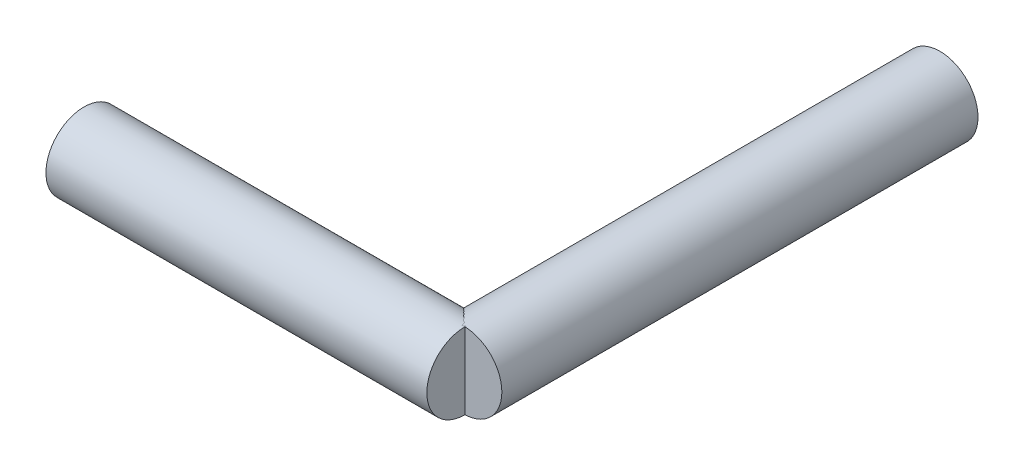
ISO-10303-21;
HEADER;
FILE_DESCRIPTION(('STEP AP214'),'2;1');
FILE_NAME('part.step','',(''),(''),'','','');
FILE_SCHEMA(('AUTOMOTIVE_DESIGN { 1 0 10303 214 1 1 1 1 }'));
ENDSEC;
DATA;
#1=APPLICATION_CONTEXT('core data for automotive mechanical design processes');
#2=APPLICATION_PROTOCOL_DEFINITION('international standard','automotive_design',2000,#1);
#3=PRODUCT_CONTEXT('',#1,'mechanical');
#4=PRODUCT('Part','Part','',(#3));
#5=PRODUCT_RELATED_PRODUCT_CATEGORY('part','',(#4));
#6=PRODUCT_DEFINITION_FORMATION('','',#4);
#7=PRODUCT_DEFINITION_CONTEXT('part definition',#1,'design');
#8=PRODUCT_DEFINITION('design','',#6,#7);
#9=PRODUCT_DEFINITION_SHAPE('','',#8);
#10=(LENGTH_UNIT() NAMED_UNIT(*) SI_UNIT(.MILLI.,.METRE.));
#11=(NAMED_UNIT(*) PLANE_ANGLE_UNIT() SI_UNIT($,.RADIAN.));
#12=(NAMED_UNIT(*) SI_UNIT($,.STERADIAN.) SOLID_ANGLE_UNIT());
#13=UNCERTAINTY_MEASURE_WITH_UNIT(LENGTH_MEASURE(1.E-05),#10,'distance_accuracy_value','');
#14=(GEOMETRIC_REPRESENTATION_CONTEXT(3) GLOBAL_UNCERTAINTY_ASSIGNED_CONTEXT((#13)) GLOBAL_UNIT_ASSIGNED_CONTEXT((#10,
#11,#12)) REPRESENTATION_CONTEXT('',''));
#15=CARTESIAN_POINT('',(0.,0.,0.));
#16=DIRECTION('',(0.,0.,1.));
#17=DIRECTION('',(1.,0.,0.));
#18=AXIS2_PLACEMENT_3D('',#15,#16,#17);
#19=CARTESIAN_POINT('',(79.7569128165846,0.,-100.));
#20=DIRECTION('',(0.,0.,1.));
#21=DIRECTION('',(1.,0.,0.));
#22=AXIS2_PLACEMENT_3D('',#19,#20,#21);
#23=CYLINDRICAL_SURFACE('',#22,8.);
#24=CARTESIAN_POINT('',(79.7569128165846,0.,-100.));
#25=DIRECTION('',(0.,0.,1.));
#26=DIRECTION('',(1.,0.,0.));
#27=AXIS2_PLACEMENT_3D('',#24,#25,#26);
#28=CIRCLE('',#27,8.);
#29=CARTESIAN_POINT('',(87.7569128165846,0.,-100.));
#30=VERTEX_POINT('',#29);
#31=EDGE_CURVE('E11',#30,#30,#28,.T.);
#32=ORIENTED_EDGE('',*,*,#31,.T.);
#33=EDGE_LOOP('',(#32));
#34=FACE_BOUND('',#33,.T.);
#35=CARTESIAN_POINT('',(79.7569128165846,0.,0.));
#36=DIRECTION('',(0.,0.,1.));
#37=DIRECTION('',(1.,0.,0.));
#38=AXIS2_PLACEMENT_3D('',#35,#36,#37);
#39=CIRCLE('',#38,8.);
#40=CARTESIAN_POINT('',(87.7569128165846,0.,0.));
#41=VERTEX_POINT('',#40);
#42=EDGE_CURVE('E55',#41,#41,#39,.T.);
#43=ORIENTED_EDGE('',*,*,#42,.F.);
#44=EDGE_LOOP('',(#43));
#45=FACE_BOUND('',#44,.T.);
#46=ADVANCED_FACE('F47',(#34,#45),#23,.T.);
#47=CARTESIAN_POINT('',(79.7569128165846,0.,-100.));
#48=DIRECTION('',(0.,0.,1.));
#49=DIRECTION('',(1.,0.,0.));
#50=AXIS2_PLACEMENT_3D('',#47,#48,#49);
#51=PLANE('',#50);
#52=ORIENTED_EDGE('',*,*,#31,.F.);
#53=EDGE_LOOP('',(#52));
#54=FACE_BOUND('',#53,.T.);
#55=ADVANCED_FACE('F61',(#54),#51,.F.);
#56=CARTESIAN_POINT('',(79.7569128165846,0.,0.));
#57=DIRECTION('',(0.,0.,1.));
#58=DIRECTION('',(1.,0.,0.));
#59=AXIS2_PLACEMENT_3D('',#56,#57,#58);
#60=PLANE('',#59);
#61=ORIENTED_EDGE('',*,*,#42,.T.);
#62=EDGE_LOOP('',(#61));
#63=FACE_BOUND('',#62,.T.);
#64=ADVANCED_FACE('F62',(#63),#60,.T.);
#65=CLOSED_SHELL('',(#46,#55,#64));
#66=MANIFOLD_SOLID_BREP('B2',#65);
#67=CARTESIAN_POINT('',(80.0000000000001,0.,0.));
#68=DIRECTION('',(-1.,0.,0.));
#69=DIRECTION('',(0.,0.,1.));
#70=AXIS2_PLACEMENT_3D('',#67,#68,#69);
#71=CYLINDRICAL_SURFACE('',#70,8.);
#72=CARTESIAN_POINT('',(80.0000000000001,0.,0.));
#73=DIRECTION('',(1.,0.,0.));
#74=DIRECTION('',(0.,0.,-1.));
#75=AXIS2_PLACEMENT_3D('',#72,#73,#74);
#76=CIRCLE('',#75,8.);
#77=CARTESIAN_POINT('',(80.0000000000001,0.,-8.));
#78=VERTEX_POINT('',#77);
#79=EDGE_CURVE('E48',#78,#78,#76,.T.);
#80=ORIENTED_EDGE('',*,*,#79,.F.);
#81=EDGE_LOOP('',(#80));
#82=FACE_BOUND('',#81,.T.);
#83=CARTESIAN_POINT('',(0.,0.,0.));
#84=DIRECTION('',(1.,0.,0.));
#85=DIRECTION('',(0.,0.,-1.));
#86=AXIS2_PLACEMENT_3D('',#83,#84,#85);
#87=CIRCLE('',#86,8.);
#88=CARTESIAN_POINT('',(0.,0.,-8.));
#89=VERTEX_POINT('',#88);
#90=EDGE_CURVE('E91',#89,#89,#87,.T.);
#91=ORIENTED_EDGE('',*,*,#90,.T.);
#92=EDGE_LOOP('',(#91));
#93=FACE_BOUND('',#92,.T.);
#94=ADVANCED_FACE('F89',(#82,#93),#71,.T.);
#95=CARTESIAN_POINT('',(80.0000000000001,0.,0.));
#96=DIRECTION('',(1.,0.,0.));
#97=DIRECTION('',(0.,0.,-1.));
#98=AXIS2_PLACEMENT_3D('',#95,#96,#97);
#99=PLANE('',#98);
#100=ORIENTED_EDGE('',*,*,#79,.T.);
#101=EDGE_LOOP('',(#100));
#102=FACE_BOUND('',#101,.T.);
#103=ADVANCED_FACE('F104',(#102),#99,.T.);
#104=CARTESIAN_POINT('',(0.,0.,0.));
#105=DIRECTION('',(1.,0.,0.));
#106=DIRECTION('',(0.,0.,-1.));
#107=AXIS2_PLACEMENT_3D('',#104,#105,#106);
#108=PLANE('',#107);
#109=ORIENTED_EDGE('',*,*,#90,.F.);
#110=EDGE_LOOP('',(#109));
#111=FACE_BOUND('',#110,.T.);
#112=ADVANCED_FACE('F103',(#111),#108,.F.);
#113=CLOSED_SHELL('',(#94,#103,#112));
#114=MANIFOLD_SOLID_BREP('B6',#113);
#115=ADVANCED_BREP_SHAPE_REPRESENTATION('',(#18,#66,#114),#14);
#116=SHAPE_DEFINITION_REPRESENTATION(#9,#115);
ENDSEC;
END-ISO-10303-21;
